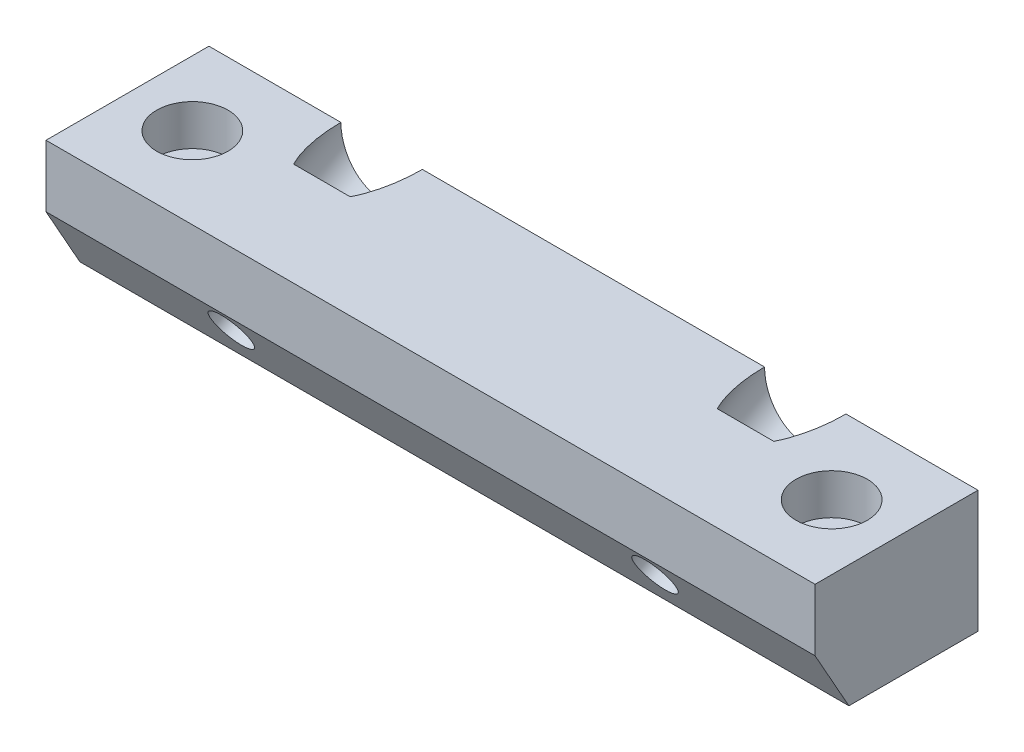
ISO-10303-21;
HEADER;
FILE_DESCRIPTION(('STEP AP214'),'2;1');
FILE_NAME('part.step','',(''),(''),'','','');
FILE_SCHEMA(('AUTOMOTIVE_DESIGN { 1 0 10303 214 1 1 1 1 }'));
ENDSEC;
DATA;
#1=APPLICATION_CONTEXT('core data for automotive mechanical design processes');
#2=APPLICATION_PROTOCOL_DEFINITION('international standard','automotive_design',2000,#1);
#3=PRODUCT_CONTEXT('',#1,'mechanical');
#4=PRODUCT('Part','Part','',(#3));
#5=PRODUCT_RELATED_PRODUCT_CATEGORY('part','',(#4));
#6=PRODUCT_DEFINITION_FORMATION('','',#4);
#7=PRODUCT_DEFINITION_CONTEXT('part definition',#1,'design');
#8=PRODUCT_DEFINITION('design','',#6,#7);
#9=PRODUCT_DEFINITION_SHAPE('','',#8);
#10=(LENGTH_UNIT() NAMED_UNIT(*) SI_UNIT(.MILLI.,.METRE.));
#11=(NAMED_UNIT(*) PLANE_ANGLE_UNIT() SI_UNIT($,.RADIAN.));
#12=(NAMED_UNIT(*) SI_UNIT($,.STERADIAN.) SOLID_ANGLE_UNIT());
#13=UNCERTAINTY_MEASURE_WITH_UNIT(LENGTH_MEASURE(1.E-05),#10,'distance_accuracy_value','');
#14=(GEOMETRIC_REPRESENTATION_CONTEXT(3) GLOBAL_UNCERTAINTY_ASSIGNED_CONTEXT((#13)) GLOBAL_UNIT_ASSIGNED_CONTEXT((#10,
#11,#12)) REPRESENTATION_CONTEXT('',''));
#15=CARTESIAN_POINT('',(0.,0.,0.));
#16=DIRECTION('',(0.,0.,1.));
#17=DIRECTION('',(1.,0.,0.));
#18=AXIS2_PLACEMENT_3D('',#15,#16,#17);
#19=CARTESIAN_POINT('',(92.964,19.05,0.));
#20=DIRECTION('',(0.,0.489717266227018,-0.871881298778186));
#21=DIRECTION('',(0.,0.871881298778186,0.489717266227018));
#22=AXIS2_PLACEMENT_3D('',#19,#20,#21);
#23=CYLINDRICAL_SURFACE('',#22,3.26389999999999);
#24=CARTESIAN_POINT('',(92.964,5.89005511263629,23.4296616262762));
#25=DIRECTION('',(0.,0.489717266227018,-0.871881298778186));
#26=DIRECTION('',(0.,0.871881298778186,0.489717266227018));
#27=AXIS2_PLACEMENT_3D('',#24,#25,#26);
#28=CIRCLE('',#27,3.26389999999999);
#29=CARTESIAN_POINT('',(92.964,8.7357884837184,25.0280498115146));
#30=VERTEX_POINT('',#29);
#31=EDGE_CURVE('E155',#30,#30,#28,.T.);
#32=ORIENTED_EDGE('',*,*,#31,.F.);
#33=EDGE_LOOP('',(#32));
#34=FACE_BOUND('',#33,.T.);
#35=CARTESIAN_POINT('',(92.964,15.0695780601068,7.08665119646911));
#36=DIRECTION('',(0.,0.489717266227018,-0.871881298778186));
#37=DIRECTION('',(0.,0.871881298778186,0.489717266227018));
#38=AXIS2_PLACEMENT_3D('',#35,#36,#37);
#39=CIRCLE('',#38,3.26389999999999);
#40=CARTESIAN_POINT('',(92.964,17.9153114311889,8.68503938170747));
#41=VERTEX_POINT('',#40);
#42=EDGE_CURVE('E126',#41,#41,#39,.F.);
#43=ORIENTED_EDGE('',*,*,#42,.F.);
#44=EDGE_LOOP('',(#43));
#45=FACE_BOUND('',#44,.T.);
#46=ADVANCED_FACE('F49',(#34,#45),#23,.F.);
#47=CARTESIAN_POINT('',(119.888,0.,20.1213423725786));
#48=DIRECTION('',(0.,1.,0.));
#49=DIRECTION('',(0.,0.,1.));
#50=AXIS2_PLACEMENT_3D('',#47,#48,#49);
#51=PLANE('',#50);
#52=CARTESIAN_POINT('',(109.77245,0.,12.7));
#53=DIRECTION('',(0.,1.,0.));
#54=DIRECTION('',(0.,0.,1.));
#55=AXIS2_PLACEMENT_3D('',#52,#53,#54);
#56=CIRCLE('',#55,3.3782);
#57=CARTESIAN_POINT('',(109.77245,0.,16.0782));
#58=VERTEX_POINT('',#57);
#59=EDGE_CURVE('E226',#58,#58,#56,.T.);
#60=ORIENTED_EDGE('',*,*,#59,.T.);
#61=EDGE_LOOP('',(#60));
#62=FACE_BOUND('',#61,.T.);
#63=CARTESIAN_POINT('',(10.11555,0.,12.7));
#64=DIRECTION('',(0.,1.,0.));
#65=DIRECTION('',(0.,0.,1.));
#66=AXIS2_PLACEMENT_3D('',#63,#64,#65);
#67=CIRCLE('',#66,3.37819999999999);
#68=CARTESIAN_POINT('',(10.11555,0.,16.0782));
#69=VERTEX_POINT('',#68);
#70=EDGE_CURVE('E196',#69,#69,#67,.T.);
#71=ORIENTED_EDGE('',*,*,#70,.T.);
#72=EDGE_LOOP('',(#71));
#73=FACE_BOUND('',#72,.T.);
#74=DIRECTION('',(0.,0.,-1.));
#75=VECTOR('',#74,1.);
#76=CARTESIAN_POINT('',(0.,0.,20.1213423725786));
#77=LINE('',#76,#75);
#78=CARTESIAN_POINT('',(0.,0.,20.1213423725786));
#79=VERTEX_POINT('',#78);
#80=CARTESIAN_POINT('',(0.,0.,0.));
#81=VERTEX_POINT('',#80);
#82=EDGE_CURVE('E192',#79,#81,#77,.T.);
#83=ORIENTED_EDGE('',*,*,#82,.T.);
#84=DIRECTION('',(-1.,0.,0.));
#85=VECTOR('',#84,1.);
#86=CARTESIAN_POINT('',(119.888,0.,0.));
#87=LINE('',#86,#85);
#88=CARTESIAN_POINT('',(119.888,0.,0.));
#89=VERTEX_POINT('',#88);
#90=EDGE_CURVE('E142',#89,#81,#87,.T.);
#91=ORIENTED_EDGE('',*,*,#90,.F.);
#92=DIRECTION('',(0.,0.,-1.));
#93=VECTOR('',#92,1.);
#94=CARTESIAN_POINT('',(119.888,0.,20.1213423725786));
#95=LINE('',#94,#93);
#96=CARTESIAN_POINT('',(119.888,0.,20.1213423725786));
#97=VERTEX_POINT('',#96);
#98=EDGE_CURVE('E181',#97,#89,#95,.T.);
#99=ORIENTED_EDGE('',*,*,#98,.F.);
#100=DIRECTION('',(-1.,0.,0.));
#101=VECTOR('',#100,1.);
#102=CARTESIAN_POINT('',(119.888,0.,20.1213423725786));
#103=LINE('',#102,#101);
#104=EDGE_CURVE('E173',#97,#79,#103,.T.);
#105=ORIENTED_EDGE('',*,*,#104,.T.);
#106=EDGE_LOOP('',(#83,#91,#99,#105));
#107=FACE_BOUND('',#106,.T.);
#108=ADVANCED_FACE('F51',(#62,#73,#107),#51,.F.);
#109=CARTESIAN_POINT('',(119.888,0.,0.));
#110=DIRECTION('',(0.,0.,1.));
#111=DIRECTION('',(1.,0.,0.));
#112=AXIS2_PLACEMENT_3D('',#109,#110,#111);
#113=PLANE('',#112);
#114=DIRECTION('',(-1.,0.,0.));
#115=VECTOR('',#114,1.);
#116=CARTESIAN_POINT('',(119.888,19.05,0.));
#117=LINE('',#116,#115);
#118=CARTESIAN_POINT('',(20.574,19.05,0.));
#119=VERTEX_POINT('',#118);
#120=CARTESIAN_POINT('',(0.,19.05,0.));
#121=VERTEX_POINT('',#120);
#122=EDGE_CURVE('E164',#119,#121,#117,.T.);
#123=ORIENTED_EDGE('',*,*,#122,.F.);
#124=CARTESIAN_POINT('',(26.924,19.05,0.));
#125=DIRECTION('',(0.,0.,1.));
#126=DIRECTION('',(0.,-1.,0.));
#127=AXIS2_PLACEMENT_3D('',#124,#125,#126);
#128=ELLIPSE('',#127,7.28310150578823,6.35);
#129=CARTESIAN_POINT('',(33.274,19.05,0.));
#130=VERTEX_POINT('',#129);
#131=EDGE_CURVE('E159',#119,#130,#128,.T.);
#132=ORIENTED_EDGE('',*,*,#131,.T.);
#133=CARTESIAN_POINT('',(86.614,19.05,0.));
#134=VERTEX_POINT('',#133);
#135=EDGE_CURVE('E163',#134,#130,#117,.T.);
#136=ORIENTED_EDGE('',*,*,#135,.F.);
#137=CARTESIAN_POINT('',(92.964,19.05,0.));
#138=DIRECTION('',(0.,0.,1.));
#139=DIRECTION('',(0.,-1.,0.));
#140=AXIS2_PLACEMENT_3D('',#137,#138,#139);
#141=ELLIPSE('',#140,7.28310150578822,6.35);
#142=CARTESIAN_POINT('',(99.314,19.05,0.));
#143=VERTEX_POINT('',#142);
#144=EDGE_CURVE('E248',#134,#143,#141,.T.);
#145=ORIENTED_EDGE('',*,*,#144,.T.);
#146=CARTESIAN_POINT('',(119.888,19.05,0.));
#147=VERTEX_POINT('',#146);
#148=EDGE_CURVE('E140',#147,#143,#117,.T.);
#149=ORIENTED_EDGE('',*,*,#148,.F.);
#150=DIRECTION('',(0.,1.,0.));
#151=VECTOR('',#150,1.);
#152=CARTESIAN_POINT('',(119.888,0.,0.));
#153=LINE('',#152,#151);
#154=EDGE_CURVE('E205',#89,#147,#153,.T.);
#155=ORIENTED_EDGE('',*,*,#154,.F.);
#156=ORIENTED_EDGE('',*,*,#90,.T.);
#157=DIRECTION('',(0.,1.,0.));
#158=VECTOR('',#157,1.);
#159=CARTESIAN_POINT('',(0.,0.,0.));
#160=LINE('',#159,#158);
#161=EDGE_CURVE('E188',#81,#121,#160,.T.);
#162=ORIENTED_EDGE('',*,*,#161,.T.);
#163=EDGE_LOOP('',(#123,#132,#136,#145,#149,#155,#156,#162));
#164=FACE_BOUND('',#163,.T.);
#165=ADVANCED_FACE('F266',(#164),#113,.F.);
#166=CARTESIAN_POINT('',(119.888,19.05,0.));
#167=DIRECTION('',(0.,-1.,0.));
#168=DIRECTION('',(0.,0.,-1.));
#169=AXIS2_PLACEMENT_3D('',#166,#167,#168);
#170=PLANE('',#169);
#171=CARTESIAN_POINT('',(109.77245,19.05,12.7));
#172=DIRECTION('',(0.,1.,0.));
#173=DIRECTION('',(0.,0.,1.));
#174=AXIS2_PLACEMENT_3D('',#171,#172,#173);
#175=CIRCLE('',#174,5.55625);
#176=CARTESIAN_POINT('',(109.77245,19.05,18.25625));
#177=VERTEX_POINT('',#176);
#178=EDGE_CURVE('E238',#177,#177,#175,.T.);
#179=ORIENTED_EDGE('',*,*,#178,.F.);
#180=EDGE_LOOP('',(#179));
#181=FACE_BOUND('',#180,.T.);
#182=CARTESIAN_POINT('',(10.11555,19.05,12.7));
#183=DIRECTION('',(0.,1.,0.));
#184=DIRECTION('',(0.,0.,1.));
#185=AXIS2_PLACEMENT_3D('',#182,#183,#184);
#186=CIRCLE('',#185,5.55625);
#187=CARTESIAN_POINT('',(10.11555,19.05,18.25625));
#188=VERTEX_POINT('',#187);
#189=EDGE_CURVE('E222',#188,#188,#186,.T.);
#190=ORIENTED_EDGE('',*,*,#189,.F.);
#191=EDGE_LOOP('',(#190));
#192=FACE_BOUND('',#191,.T.);
#193=DIRECTION('',(-1.,0.,0.));
#194=VECTOR('',#193,1.);
#195=CARTESIAN_POINT('',(119.888,19.05,9.32236992740893));
#196=LINE('',#195,#194);
#197=CARTESIAN_POINT('',(31.337649616422,19.05,9.32236992740894));
#198=VERTEX_POINT('',#197);
#199=CARTESIAN_POINT('',(22.510350383578,19.05,9.32236992740894));
#200=VERTEX_POINT('',#199);
#201=EDGE_CURVE('E151',#198,#200,#196,.T.);
#202=ORIENTED_EDGE('',*,*,#201,.T.);
#203=CARTESIAN_POINT('',(26.924,19.05,0.));
#204=DIRECTION('',(0.,-1.,0.));
#205=DIRECTION('',(0.,0.,1.));
#206=AXIS2_PLACEMENT_3D('',#203,#204,#205);
#207=ELLIPSE('',#206,12.9666655393285,6.35);
#208=EDGE_CURVE('E11',#200,#119,#207,.T.);
#209=ORIENTED_EDGE('',*,*,#208,.T.);
#210=ORIENTED_EDGE('',*,*,#122,.T.);
#211=DIRECTION('',(0.,0.,1.));
#212=VECTOR('',#211,1.);
#213=CARTESIAN_POINT('',(0.,19.05,0.));
#214=LINE('',#213,#212);
#215=CARTESIAN_POINT('',(0.,19.05,25.4));
#216=VERTEX_POINT('',#215);
#217=EDGE_CURVE('E185',#121,#216,#214,.T.);
#218=ORIENTED_EDGE('',*,*,#217,.T.);
#219=DIRECTION('',(-1.,0.,0.));
#220=VECTOR('',#219,1.);
#221=CARTESIAN_POINT('',(119.888,19.05,25.4));
#222=LINE('',#221,#220);
#223=CARTESIAN_POINT('',(119.888,19.05,25.4));
#224=VERTEX_POINT('',#223);
#225=EDGE_CURVE('E165',#224,#216,#222,.T.);
#226=ORIENTED_EDGE('',*,*,#225,.F.);
#227=DIRECTION('',(0.,0.,1.));
#228=VECTOR('',#227,1.);
#229=CARTESIAN_POINT('',(119.888,19.05,0.));
#230=LINE('',#229,#228);
#231=EDGE_CURVE('E202',#147,#224,#230,.T.);
#232=ORIENTED_EDGE('',*,*,#231,.F.);
#233=ORIENTED_EDGE('',*,*,#148,.T.);
#234=CARTESIAN_POINT('',(92.964,19.05,0.));
#235=DIRECTION('',(0.,-1.,0.));
#236=DIRECTION('',(0.,0.,1.));
#237=AXIS2_PLACEMENT_3D('',#234,#235,#236);
#238=ELLIPSE('',#237,12.9666655393284,6.35);
#239=CARTESIAN_POINT('',(97.3776496164219,19.05,9.32236992740894));
#240=VERTEX_POINT('',#239);
#241=EDGE_CURVE('E130',#143,#240,#238,.T.);
#242=ORIENTED_EDGE('',*,*,#241,.T.);
#243=DIRECTION('',(1.,0.,0.));
#244=VECTOR('',#243,1.);
#245=CARTESIAN_POINT('',(119.888,19.05,9.32236992740893));
#246=LINE('',#245,#244);
#247=CARTESIAN_POINT('',(88.550350383578,19.05,9.32236992740894));
#248=VERTEX_POINT('',#247);
#249=EDGE_CURVE('E119',#248,#240,#246,.T.);
#250=ORIENTED_EDGE('',*,*,#249,.F.);
#251=EDGE_CURVE('E132',#248,#134,#238,.T.);
#252=ORIENTED_EDGE('',*,*,#251,.T.);
#253=ORIENTED_EDGE('',*,*,#135,.T.);
#254=EDGE_CURVE('E53',#130,#198,#207,.T.);
#255=ORIENTED_EDGE('',*,*,#254,.T.);
#256=EDGE_LOOP('',(#202,#209,#210,#218,#226,#232,#233,#242,#250,#252,#253,#255));
#257=FACE_BOUND('',#256,.T.);
#258=ADVANCED_FACE('F137',(#181,#192,#257),#170,.F.);
#259=CARTESIAN_POINT('',(119.888,19.05,25.4));
#260=DIRECTION('',(0.,0.,-1.));
#261=DIRECTION('',(-1.,0.,0.));
#262=AXIS2_PLACEMENT_3D('',#259,#260,#261);
#263=PLANE('',#262);
#264=DIRECTION('',(0.,-1.,0.));
#265=VECTOR('',#264,1.);
#266=CARTESIAN_POINT('',(0.,19.05,25.4));
#267=LINE('',#266,#265);
#268=CARTESIAN_POINT('',(0.,9.398,25.4));
#269=VERTEX_POINT('',#268);
#270=EDGE_CURVE('E182',#216,#269,#267,.T.);
#271=ORIENTED_EDGE('',*,*,#270,.T.);
#272=DIRECTION('',(-1.,0.,0.));
#273=VECTOR('',#272,1.);
#274=CARTESIAN_POINT('',(119.888,9.398,25.4));
#275=LINE('',#274,#273);
#276=CARTESIAN_POINT('',(119.888,9.398,25.4));
#277=VERTEX_POINT('',#276);
#278=EDGE_CURVE('E169',#277,#269,#275,.T.);
#279=ORIENTED_EDGE('',*,*,#278,.F.);
#280=DIRECTION('',(0.,-1.,0.));
#281=VECTOR('',#280,1.);
#282=CARTESIAN_POINT('',(119.888,19.05,25.4));
#283=LINE('',#282,#281);
#284=EDGE_CURVE('E199',#224,#277,#283,.T.);
#285=ORIENTED_EDGE('',*,*,#284,.F.);
#286=ORIENTED_EDGE('',*,*,#225,.T.);
#287=EDGE_LOOP('',(#271,#279,#285,#286));
#288=FACE_BOUND('',#287,.T.);
#289=ADVANCED_FACE('F275',(#288),#263,.F.);
#290=CARTESIAN_POINT('',(119.888,9.398,25.4));
#291=DIRECTION('',(0.,0.489717266227018,-0.871881298778186));
#292=DIRECTION('',(0.,0.871881298778186,0.489717266227018));
#293=AXIS2_PLACEMENT_3D('',#290,#291,#292);
#294=PLANE('',#293);
#295=ORIENTED_EDGE('',*,*,#31,.T.);
#296=EDGE_LOOP('',(#295));
#297=FACE_BOUND('',#296,.T.);
#298=CARTESIAN_POINT('',(26.924,5.89005511263629,23.4296616262762));
#299=DIRECTION('',(0.,0.489717266227018,-0.871881298778186));
#300=DIRECTION('',(0.,0.871881298778186,0.489717266227018));
#301=AXIS2_PLACEMENT_3D('',#298,#299,#300);
#302=CIRCLE('',#301,3.2639);
#303=CARTESIAN_POINT('',(26.924,8.73578848371841,25.0280498115146));
#304=VERTEX_POINT('',#303);
#305=EDGE_CURVE('E158',#304,#304,#302,.T.);
#306=ORIENTED_EDGE('',*,*,#305,.T.);
#307=EDGE_LOOP('',(#306));
#308=FACE_BOUND('',#307,.T.);
#309=DIRECTION('',(0.,-0.871881298778186,-0.489717266227018));
#310=VECTOR('',#309,1.);
#311=CARTESIAN_POINT('',(0.,9.398,25.4));
#312=LINE('',#311,#310);
#313=EDGE_CURVE('E178',#269,#79,#312,.T.);
#314=ORIENTED_EDGE('',*,*,#313,.T.);
#315=ORIENTED_EDGE('',*,*,#104,.F.);
#316=DIRECTION('',(0.,-0.871881298778186,-0.489717266227018));
#317=VECTOR('',#316,1.);
#318=CARTESIAN_POINT('',(119.888,9.398,25.4));
#319=LINE('',#318,#317);
#320=EDGE_CURVE('E177',#277,#97,#319,.T.);
#321=ORIENTED_EDGE('',*,*,#320,.F.);
#322=ORIENTED_EDGE('',*,*,#278,.T.);
#323=EDGE_LOOP('',(#314,#315,#321,#322));
#324=FACE_BOUND('',#323,.T.);
#325=ADVANCED_FACE('F279',(#297,#308,#324),#294,.F.);
#326=CARTESIAN_POINT('',(119.888,0.,0.));
#327=DIRECTION('',(1.,0.,0.));
#328=DIRECTION('',(0.,0.,-1.));
#329=AXIS2_PLACEMENT_3D('',#326,#327,#328);
#330=PLANE('',#329);
#331=ORIENTED_EDGE('',*,*,#98,.T.);
#332=ORIENTED_EDGE('',*,*,#154,.T.);
#333=ORIENTED_EDGE('',*,*,#231,.T.);
#334=ORIENTED_EDGE('',*,*,#284,.T.);
#335=ORIENTED_EDGE('',*,*,#320,.T.);
#336=EDGE_LOOP('',(#331,#332,#333,#334,#335));
#337=FACE_BOUND('',#336,.T.);
#338=ADVANCED_FACE('F283',(#337),#330,.T.);
#339=CARTESIAN_POINT('',(0.,0.,0.));
#340=DIRECTION('',(1.,0.,0.));
#341=DIRECTION('',(0.,0.,-1.));
#342=AXIS2_PLACEMENT_3D('',#339,#340,#341);
#343=PLANE('',#342);
#344=ORIENTED_EDGE('',*,*,#82,.F.);
#345=ORIENTED_EDGE('',*,*,#313,.F.);
#346=ORIENTED_EDGE('',*,*,#270,.F.);
#347=ORIENTED_EDGE('',*,*,#217,.F.);
#348=ORIENTED_EDGE('',*,*,#161,.F.);
#349=EDGE_LOOP('',(#344,#345,#346,#347,#348));
#350=FACE_BOUND('',#349,.T.);
#351=ADVANCED_FACE('F271',(#350),#343,.F.);
#352=CARTESIAN_POINT('',(10.11555,19.05,12.7));
#353=DIRECTION('',(0.,1.,0.));
#354=DIRECTION('',(0.,0.,1.));
#355=AXIS2_PLACEMENT_3D('',#352,#353,#354);
#356=CYLINDRICAL_SURFACE('',#355,3.3782);
#357=ORIENTED_EDGE('',*,*,#70,.F.);
#358=EDGE_LOOP('',(#357));
#359=FACE_BOUND('',#358,.T.);
#360=CARTESIAN_POINT('',(10.11555,12.7,12.7));
#361=DIRECTION('',(0.,1.,0.));
#362=DIRECTION('',(0.,0.,1.));
#363=AXIS2_PLACEMENT_3D('',#360,#361,#362);
#364=CIRCLE('',#363,3.3782);
#365=CARTESIAN_POINT('',(10.11555,12.7,16.0782));
#366=VERTEX_POINT('',#365);
#367=EDGE_CURVE('E214',#366,#366,#364,.T.);
#368=ORIENTED_EDGE('',*,*,#367,.T.);
#369=EDGE_LOOP('',(#368));
#370=FACE_BOUND('',#369,.T.);
#371=ADVANCED_FACE('F299',(#359,#370),#356,.F.);
#372=CARTESIAN_POINT('',(13.49375,12.7,12.7));
#373=DIRECTION('',(0.,-1.,0.));
#374=DIRECTION('',(0.,0.,-1.));
#375=AXIS2_PLACEMENT_3D('',#372,#373,#374);
#376=PLANE('',#375);
#377=ORIENTED_EDGE('',*,*,#367,.F.);
#378=EDGE_LOOP('',(#377));
#379=FACE_BOUND('',#378,.T.);
#380=CARTESIAN_POINT('',(10.11555,12.7,12.7));
#381=DIRECTION('',(0.,1.,0.));
#382=DIRECTION('',(0.,0.,1.));
#383=AXIS2_PLACEMENT_3D('',#380,#381,#382);
#384=CIRCLE('',#383,5.55625);
#385=CARTESIAN_POINT('',(10.11555,12.7,18.25625));
#386=VERTEX_POINT('',#385);
#387=EDGE_CURVE('E218',#386,#386,#384,.T.);
#388=ORIENTED_EDGE('',*,*,#387,.T.);
#389=EDGE_LOOP('',(#388));
#390=FACE_BOUND('',#389,.T.);
#391=ADVANCED_FACE('F301',(#379,#390),#376,.F.);
#392=CARTESIAN_POINT('',(10.11555,19.05,12.7));
#393=DIRECTION('',(0.,1.,0.));
#394=DIRECTION('',(0.,0.,1.));
#395=AXIS2_PLACEMENT_3D('',#392,#393,#394);
#396=CYLINDRICAL_SURFACE('',#395,5.55625);
#397=ORIENTED_EDGE('',*,*,#387,.F.);
#398=EDGE_LOOP('',(#397));
#399=FACE_BOUND('',#398,.T.);
#400=ORIENTED_EDGE('',*,*,#189,.T.);
#401=EDGE_LOOP('',(#400));
#402=FACE_BOUND('',#401,.T.);
#403=ADVANCED_FACE('F307',(#399,#402),#396,.F.);
#404=CARTESIAN_POINT('',(109.77245,19.05,12.7));
#405=DIRECTION('',(0.,1.,0.));
#406=DIRECTION('',(0.,0.,1.));
#407=AXIS2_PLACEMENT_3D('',#404,#405,#406);
#408=CYLINDRICAL_SURFACE('',#407,3.3782);
#409=ORIENTED_EDGE('',*,*,#59,.F.);
#410=EDGE_LOOP('',(#409));
#411=FACE_BOUND('',#410,.T.);
#412=CARTESIAN_POINT('',(109.77245,12.7,12.7));
#413=DIRECTION('',(0.,1.,0.));
#414=DIRECTION('',(0.,0.,1.));
#415=AXIS2_PLACEMENT_3D('',#412,#413,#414);
#416=CIRCLE('',#415,3.3782);
#417=CARTESIAN_POINT('',(109.77245,12.7,16.0782));
#418=VERTEX_POINT('',#417);
#419=EDGE_CURVE('E230',#418,#418,#416,.T.);
#420=ORIENTED_EDGE('',*,*,#419,.T.);
#421=EDGE_LOOP('',(#420));
#422=FACE_BOUND('',#421,.T.);
#423=ADVANCED_FACE('F313',(#411,#422),#408,.F.);
#424=CARTESIAN_POINT('',(113.15065,12.7,12.7));
#425=DIRECTION('',(0.,-1.,0.));
#426=DIRECTION('',(0.,0.,-1.));
#427=AXIS2_PLACEMENT_3D('',#424,#425,#426);
#428=PLANE('',#427);
#429=ORIENTED_EDGE('',*,*,#419,.F.);
#430=EDGE_LOOP('',(#429));
#431=FACE_BOUND('',#430,.T.);
#432=CARTESIAN_POINT('',(109.77245,12.7,12.7));
#433=DIRECTION('',(0.,1.,0.));
#434=DIRECTION('',(0.,0.,1.));
#435=AXIS2_PLACEMENT_3D('',#432,#433,#434);
#436=CIRCLE('',#435,5.55625);
#437=CARTESIAN_POINT('',(109.77245,12.7,18.25625));
#438=VERTEX_POINT('',#437);
#439=EDGE_CURVE('E234',#438,#438,#436,.T.);
#440=ORIENTED_EDGE('',*,*,#439,.T.);
#441=EDGE_LOOP('',(#440));
#442=FACE_BOUND('',#441,.T.);
#443=ADVANCED_FACE('F336',(#431,#442),#428,.F.);
#444=CARTESIAN_POINT('',(109.77245,19.05,12.7));
#445=DIRECTION('',(0.,1.,0.));
#446=DIRECTION('',(0.,0.,1.));
#447=AXIS2_PLACEMENT_3D('',#444,#445,#446);
#448=CYLINDRICAL_SURFACE('',#447,5.55625);
#449=ORIENTED_EDGE('',*,*,#439,.F.);
#450=EDGE_LOOP('',(#449));
#451=FACE_BOUND('',#450,.T.);
#452=ORIENTED_EDGE('',*,*,#178,.T.);
#453=EDGE_LOOP('',(#452));
#454=FACE_BOUND('',#453,.T.);
#455=ADVANCED_FACE('F340',(#451,#454),#448,.F.);
#456=CARTESIAN_POINT('',(26.924,19.05,0.));
#457=DIRECTION('',(0.,0.489717266227018,-0.871881298778186));
#458=DIRECTION('',(0.,0.871881298778186,0.489717266227018));
#459=AXIS2_PLACEMENT_3D('',#456,#457,#458);
#460=CYLINDRICAL_SURFACE('',#459,3.2639);
#461=CARTESIAN_POINT('',(26.924,15.0695780601068,7.08665119646911));
#462=DIRECTION('',(0.,-0.489717266227018,0.871881298778186));
#463=DIRECTION('',(0.,-0.871881298778186,-0.489717266227018));
#464=AXIS2_PLACEMENT_3D('',#461,#462,#463);
#465=CIRCLE('',#464,3.2639);
#466=CARTESIAN_POINT('',(26.924,12.2238446890247,5.48826301123075));
#467=VERTEX_POINT('',#466);
#468=EDGE_CURVE('E125',#467,#467,#465,.F.);
#469=ORIENTED_EDGE('',*,*,#468,.T.);
#470=EDGE_LOOP('',(#469));
#471=FACE_BOUND('',#470,.T.);
#472=ORIENTED_EDGE('',*,*,#305,.F.);
#473=EDGE_LOOP('',(#472));
#474=FACE_BOUND('',#473,.T.);
#475=ADVANCED_FACE('F344',(#471,#474),#460,.F.);
#476=CARTESIAN_POINT('',(92.964,19.05,0.));
#477=DIRECTION('',(0.,-0.489717266227018,0.871881298778186));
#478=DIRECTION('',(0.,-0.871881298778186,-0.489717266227018));
#479=AXIS2_PLACEMENT_3D('',#476,#477,#478);
#480=CYLINDRICAL_SURFACE('',#479,6.35);
#481=CARTESIAN_POINT('',(92.964,15.0695780601068,7.08665119646911));
#482=DIRECTION('',(0.,-0.489717266227018,0.871881298778186));
#483=DIRECTION('',(0.,0.871881298778186,0.489717266227018));
#484=AXIS2_PLACEMENT_3D('',#481,#482,#483);
#485=CIRCLE('',#484,6.35);
#486=EDGE_CURVE('E71',#248,#240,#485,.T.);
#487=ORIENTED_EDGE('',*,*,#486,.T.);
#488=ORIENTED_EDGE('',*,*,#241,.F.);
#489=ORIENTED_EDGE('',*,*,#144,.F.);
#490=ORIENTED_EDGE('',*,*,#251,.F.);
#491=EDGE_LOOP('',(#487,#488,#489,#490));
#492=FACE_BOUND('',#491,.T.);
#493=ADVANCED_FACE('F129',(#492),#480,.F.);
#494=CARTESIAN_POINT('',(92.964,15.0695780601068,7.08665119646911));
#495=DIRECTION('',(0.,0.489717266227018,-0.871881298778186));
#496=DIRECTION('',(0.,0.871881298778186,0.489717266227018));
#497=AXIS2_PLACEMENT_3D('',#494,#495,#496);
#498=PLANE('',#497);
#499=ORIENTED_EDGE('',*,*,#42,.T.);
#500=EDGE_LOOP('',(#499));
#501=FACE_BOUND('',#500,.T.);
#502=ORIENTED_EDGE('',*,*,#249,.T.);
#503=ORIENTED_EDGE('',*,*,#486,.F.);
#504=EDGE_LOOP('',(#502,#503));
#505=FACE_BOUND('',#504,.T.);
#506=ADVANCED_FACE('F120',(#501,#505),#498,.T.);
#507=CARTESIAN_POINT('',(26.924,19.05,0.));
#508=DIRECTION('',(0.,-0.489717266227018,0.871881298778186));
#509=DIRECTION('',(0.,-0.871881298778186,-0.489717266227018));
#510=AXIS2_PLACEMENT_3D('',#507,#508,#509);
#511=CYLINDRICAL_SURFACE('',#510,6.35);
#512=CARTESIAN_POINT('',(26.924,15.0695780601068,7.08665119646911));
#513=DIRECTION('',(0.,-0.489717266227018,0.871881298778186));
#514=DIRECTION('',(0.,-0.871881298778186,-0.489717266227018));
#515=AXIS2_PLACEMENT_3D('',#512,#513,#514);
#516=CIRCLE('',#515,6.35);
#517=EDGE_CURVE('E64',#200,#198,#516,.T.);
#518=ORIENTED_EDGE('',*,*,#517,.T.);
#519=ORIENTED_EDGE('',*,*,#254,.F.);
#520=ORIENTED_EDGE('',*,*,#131,.F.);
#521=ORIENTED_EDGE('',*,*,#208,.F.);
#522=EDGE_LOOP('',(#518,#519,#520,#521));
#523=FACE_BOUND('',#522,.T.);
#524=ADVANCED_FACE('F256',(#523),#511,.F.);
#525=CARTESIAN_POINT('',(26.924,15.0695780601068,7.08665119646911));
#526=DIRECTION('',(0.,-0.489717266227018,0.871881298778186));
#527=DIRECTION('',(0.,-0.871881298778186,-0.489717266227018));
#528=AXIS2_PLACEMENT_3D('',#525,#526,#527);
#529=PLANE('',#528);
#530=ORIENTED_EDGE('',*,*,#468,.F.);
#531=EDGE_LOOP('',(#530));
#532=FACE_BOUND('',#531,.T.);
#533=ORIENTED_EDGE('',*,*,#517,.F.);
#534=ORIENTED_EDGE('',*,*,#201,.F.);
#535=EDGE_LOOP('',(#533,#534));
#536=FACE_BOUND('',#535,.T.);
#537=ADVANCED_FACE('F356',(#532,#536),#529,.F.);
#538=CLOSED_SHELL('',(#46,#108,#165,#258,#289,#325,#338,#351,#371,#391,#403,#423,#443,#455,#475,
#493,#506,#524,#537));
#539=MANIFOLD_SOLID_BREP('B2',#538);
#540=ADVANCED_BREP_SHAPE_REPRESENTATION('',(#18,#539),#14);
#541=SHAPE_DEFINITION_REPRESENTATION(#9,#540);
ENDSEC;
END-ISO-10303-21;
